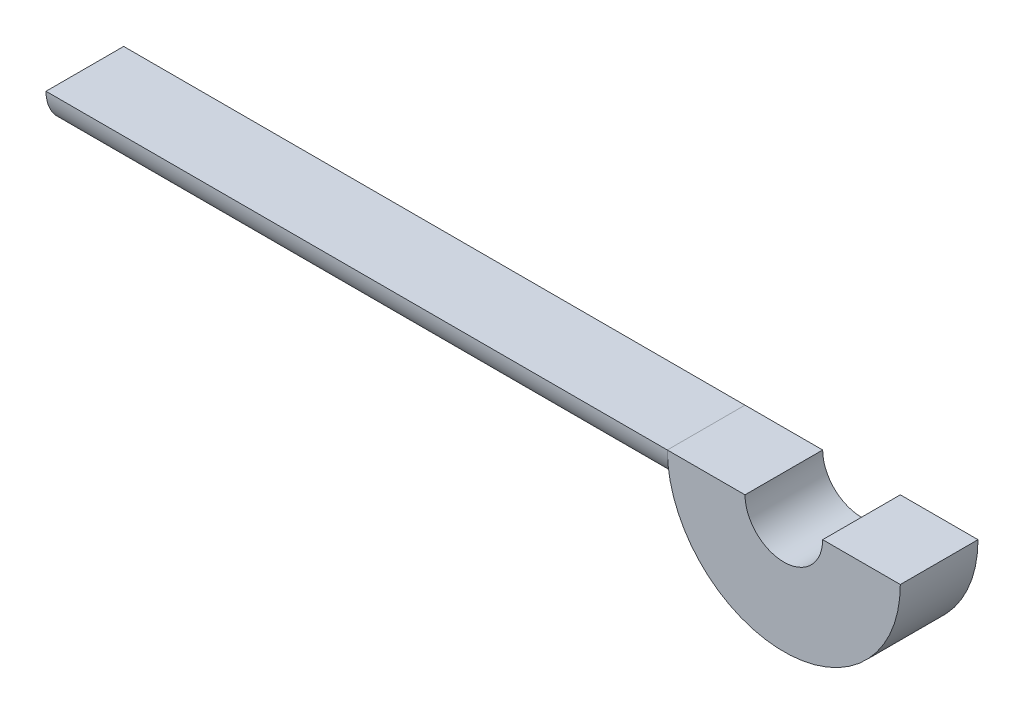
ISO-10303-21;
HEADER;
FILE_DESCRIPTION(('STEP AP214'),'2;1');
FILE_NAME('part.step','',(''),(''),'','','');
FILE_SCHEMA(('AUTOMOTIVE_DESIGN { 1 0 10303 214 1 1 1 1 }'));
ENDSEC;
DATA;
#1=APPLICATION_CONTEXT('core data for automotive mechanical design processes');
#2=APPLICATION_PROTOCOL_DEFINITION('international standard','automotive_design',2000,#1);
#3=PRODUCT_CONTEXT('',#1,'mechanical');
#4=PRODUCT('Part','Part','',(#3));
#5=PRODUCT_RELATED_PRODUCT_CATEGORY('part','',(#4));
#6=PRODUCT_DEFINITION_FORMATION('','',#4);
#7=PRODUCT_DEFINITION_CONTEXT('part definition',#1,'design');
#8=PRODUCT_DEFINITION('design','',#6,#7);
#9=PRODUCT_DEFINITION_SHAPE('','',#8);
#10=(LENGTH_UNIT() NAMED_UNIT(*) SI_UNIT(.MILLI.,.METRE.));
#11=(NAMED_UNIT(*) PLANE_ANGLE_UNIT() SI_UNIT($,.RADIAN.));
#12=(NAMED_UNIT(*) SI_UNIT($,.STERADIAN.) SOLID_ANGLE_UNIT());
#13=UNCERTAINTY_MEASURE_WITH_UNIT(LENGTH_MEASURE(1.E-05),#10,'distance_accuracy_value','');
#14=(GEOMETRIC_REPRESENTATION_CONTEXT(3) GLOBAL_UNCERTAINTY_ASSIGNED_CONTEXT((#13)) GLOBAL_UNIT_ASSIGNED_CONTEXT((#10,
#11,#12)) REPRESENTATION_CONTEXT('',''));
#15=CARTESIAN_POINT('',(0.,0.,0.));
#16=DIRECTION('',(0.,0.,1.));
#17=DIRECTION('',(1.,0.,0.));
#18=AXIS2_PLACEMENT_3D('',#15,#16,#17);
#19=CARTESIAN_POINT('',(0.,0.,6.35));
#20=DIRECTION('',(0.,0.,-1.));
#21=DIRECTION('',(-1.,0.,0.));
#22=AXIS2_PLACEMENT_3D('',#19,#20,#21);
#23=CYLINDRICAL_SURFACE('',#22,9.525);
#24=DIRECTION('',(0.,0.,1.));
#25=VECTOR('',#24,1.);
#26=CARTESIAN_POINT('',(-9.525,0.,0.));
#27=LINE('',#26,#25);
#28=CARTESIAN_POINT('',(-9.525,0.,0.));
#29=VERTEX_POINT('',#28);
#30=CARTESIAN_POINT('',(-9.525,0.,6.35));
#31=VERTEX_POINT('',#30);
#32=EDGE_CURVE('E47',#29,#31,#27,.T.);
#33=ORIENTED_EDGE('',*,*,#32,.T.);
#34=CARTESIAN_POINT('',(-9.525,0.,0.));
#35=CARTESIAN_POINT('',(-9.52501109919511,-0.0867584663977062,-1.11023860255168E-05));
#36=CARTESIAN_POINT('',(-9.52381490358395,-0.173509981731211,0.00355585934786174));
#37=CARTESIAN_POINT('',(-9.51909051162096,-0.346349012163513,0.0177597090178191));
#38=CARTESIAN_POINT('',(-9.51556285042762,-0.432436675054733,0.0283949745171486));
#39=CARTESIAN_POINT('',(-9.50627066001762,-0.60310661085966,0.056610999257891));
#40=CARTESIAN_POINT('',(-9.50051222160622,-0.687692332518318,0.0741728488373395));
#41=CARTESIAN_POINT('',(-9.48692225142781,-0.854978122631563,0.116065153540351));
#42=CARTESIAN_POINT('',(-9.47909066544468,-0.937678141710584,0.140395785679202));
#43=CARTESIAN_POINT('',(-9.4527851286968,-1.18202990115731,0.223232040874511));
#44=CARTESIAN_POINT('',(-9.43148755146662,-1.34015489920263,0.291619079964345));
#45=CARTESIAN_POINT('',(-9.38354321416617,-1.64264871240488,0.452546220210758));
#46=CARTESIAN_POINT('',(-9.3568937765036,-1.78701058819631,0.545098418436042));
#47=CARTESIAN_POINT('',(-9.30002341411486,-2.06291917458793,0.755092906094043));
#48=CARTESIAN_POINT('',(-9.26971730868141,-2.19392903526256,0.873218591562464));
#49=CARTESIAN_POINT('',(-9.20941621515659,-2.43469108780347,1.12955519328071));
#50=CARTESIAN_POINT('',(-9.1794213110126,-2.54443767806284,1.26777138544509));
#51=CARTESIAN_POINT('',(-9.12219770766827,-2.74264577137865,1.56523083998159));
#52=CARTESIAN_POINT('',(-9.09507334426462,-2.8304045251794,1.72496442923284));
#53=CARTESIAN_POINT('',(-9.04796508339338,-2.97757762410698,2.05796654735069));
#54=CARTESIAN_POINT('',(-9.0279787037604,-3.03700182471635,2.23123034562533));
#55=CARTESIAN_POINT('',(-8.99830903266046,-3.1237977547545,2.58023567965367));
#56=CARTESIAN_POINT('',(-8.98830124776583,-3.1521820951177,2.75569697695605));
#57=CARTESIAN_POINT('',(-8.97876208987997,-3.17925810515429,3.10915871241872));
#58=CARTESIAN_POINT('',(-8.97922769686119,-3.17795833431035,3.28715840383235));
#59=CARTESIAN_POINT('',(-8.99029876006837,-3.14648808580141,3.6319998447936));
#60=CARTESIAN_POINT('',(-9.00043983116337,-3.11763977550622,3.7989797508632));
#61=CARTESIAN_POINT('',(-9.02895910755938,-3.03404893324102,4.12557606992812));
#62=CARTESIAN_POINT('',(-9.04733819768608,-2.97930361970155,4.2851916899116));
#63=CARTESIAN_POINT('',(-9.09059374930723,-2.84460615052577,4.59553598381));
#64=CARTESIAN_POINT('',(-9.11557013374658,-2.76426204041518,4.74608001551939));
#65=CARTESIAN_POINT('',(-9.169163889702,-2.58092286667849,5.03196583018198));
#66=CARTESIAN_POINT('',(-9.1977822899943,-2.47792139691606,5.16730329725184));
#67=CARTESIAN_POINT('',(-9.25726024974148,-2.2458417076995,5.42635532027382));
#68=CARTESIAN_POINT('',(-9.28815887400631,-2.11568411554187,5.54909635365483));
#69=CARTESIAN_POINT('',(-9.34741529251624,-1.83626167057156,5.77127833228254));
#70=CARTESIAN_POINT('',(-9.37577242060814,-1.68699183299057,5.870713179697));
#71=CARTESIAN_POINT('',(-9.42713388591759,-1.37131076109635,6.0442924052174));
#72=CARTESIAN_POINT('',(-9.45007943454874,-1.20473727740139,6.11816276608183));
#73=CARTESIAN_POINT('',(-9.47821244443844,-0.946916440217424,6.20687528720103));
#74=CARTESIAN_POINT('',(-9.48654189071096,-0.859661200510917,6.2327620360959));
#75=CARTESIAN_POINT('',(-9.50088667992203,-0.683081906441541,6.27698176698283));
#76=CARTESIAN_POINT('',(-9.50690305067526,-0.593758789689705,6.29531810425675));
#77=CARTESIAN_POINT('',(-9.51607743691077,-0.420519434762281,6.32315751821451));
#78=CARTESIAN_POINT('',(-9.51941645032147,-0.336702022900161,6.33322138863382));
#79=CARTESIAN_POINT('',(-9.52388099236767,-0.168592339160273,6.34664255783373));
#80=CARTESIAN_POINT('',(-9.5250096152151,-0.084300896973188,6.35000923177883));
#81=CARTESIAN_POINT('',(-9.525,-1.87880717499807E-13,6.35));
#82=B_SPLINE_CURVE_WITH_KNOTS('',3,(#34,#35,#36,#37,#38,#39,#40,#41,#42,#43,#44,#45,#46,#47,#48,
#49,#50,#51,#52,#53,#54,#55,#56,#57,#58,#59,#60,#61,#62,#63,#64,#65,#66,#67,#68,#69,#70,#71,#72,
#73,#74,#75,#76,#77,#78,#79,#80,#81),.UNSPECIFIED.,.F.,.F.,(4,2,2,2,2,2,2,2,2,2,2,2,2,2,2,2,2,2,
2,2,2,2,2,4),(0.,0.260182031119286,0.52030436147065,0.779721416079441,1.0391452555276,
1.55732642770898,2.07576750018385,2.61030044044256,3.14497400743342,3.6950211945242,
4.24487692131438,4.77620387995586,5.30737763116523,5.81427561490482,6.3212280563819,
6.83634924065959,7.35161625780968,7.89374085367835,8.43600713312646,8.98391776815773,
9.25780219945113,9.53156478920259,9.78473028079912,10.0375411250328),.UNSPECIFIED.);
#83=EDGE_CURVE('E12',#29,#31,#82,.T.);
#84=ORIENTED_EDGE('',*,*,#83,.F.);
#85=EDGE_LOOP('',(#33,#84));
#86=FACE_BOUND('',#85,.T.);
#87=ADVANCED_FACE('F42',(#86),#23,.F.);
#88=CARTESIAN_POINT('',(500000.,0.,3.175));
#89=DIRECTION('',(-1.,0.,0.));
#90=DIRECTION('',(0.,0.,1.));
#91=AXIS2_PLACEMENT_3D('',#88,#89,#90);
#92=CYLINDRICAL_SURFACE('',#91,3.175);
#93=ORIENTED_EDGE('',*,*,#83,.T.);
#94=DIRECTION('',(1.,0.,0.));
#95=VECTOR('',#94,1.);
#96=CARTESIAN_POINT('',(-60.325,0.,6.35));
#97=LINE('',#96,#95);
#98=CARTESIAN_POINT('',(-60.325,0.,6.35));
#99=VERTEX_POINT('',#98);
#100=EDGE_CURVE('E58',#99,#31,#97,.T.);
#101=ORIENTED_EDGE('',*,*,#100,.F.);
#102=CARTESIAN_POINT('',(-60.325,0.,3.175));
#103=DIRECTION('',(-1.,0.,0.));
#104=DIRECTION('',(0.,0.,1.));
#105=AXIS2_PLACEMENT_3D('',#102,#103,#104);
#106=CIRCLE('',#105,3.175);
#107=CARTESIAN_POINT('',(-60.325,0.,0.));
#108=VERTEX_POINT('',#107);
#109=EDGE_CURVE('E71',#108,#99,#106,.T.);
#110=ORIENTED_EDGE('',*,*,#109,.F.);
#111=DIRECTION('',(1.,0.,0.));
#112=VECTOR('',#111,1.);
#113=CARTESIAN_POINT('',(-60.325,0.,0.));
#114=LINE('',#113,#112);
#115=EDGE_CURVE('E63',#108,#29,#114,.T.);
#116=ORIENTED_EDGE('',*,*,#115,.T.);
#117=EDGE_LOOP('',(#93,#101,#110,#116));
#118=FACE_BOUND('',#117,.T.);
#119=ADVANCED_FACE('F44',(#118),#92,.T.);
#120=CARTESIAN_POINT('',(-60.325,0.,0.));
#121=DIRECTION('',(0.,1.,0.));
#122=DIRECTION('',(0.,0.,1.));
#123=AXIS2_PLACEMENT_3D('',#120,#121,#122);
#124=PLANE('',#123);
#125=ORIENTED_EDGE('',*,*,#32,.F.);
#126=ORIENTED_EDGE('',*,*,#115,.F.);
#127=DIRECTION('',(0.,0.,1.));
#128=VECTOR('',#127,1.);
#129=CARTESIAN_POINT('',(-60.325,0.,0.));
#130=LINE('',#129,#128);
#131=EDGE_CURVE('E73',#108,#99,#130,.T.);
#132=ORIENTED_EDGE('',*,*,#131,.T.);
#133=ORIENTED_EDGE('',*,*,#100,.T.);
#134=EDGE_LOOP('',(#125,#126,#132,#133));
#135=FACE_BOUND('',#134,.T.);
#136=ADVANCED_FACE('F75',(#135),#124,.T.);
#137=CARTESIAN_POINT('',(-60.325,0.,3.175));
#138=DIRECTION('',(-1.,0.,0.));
#139=DIRECTION('',(0.,0.,1.));
#140=AXIS2_PLACEMENT_3D('',#137,#138,#139);
#141=PLANE('',#140);
#142=ORIENTED_EDGE('',*,*,#109,.T.);
#143=ORIENTED_EDGE('',*,*,#131,.F.);
#144=EDGE_LOOP('',(#142,#143));
#145=FACE_BOUND('',#144,.T.);
#146=ADVANCED_FACE('F92',(#145),#141,.T.);
#147=CLOSED_SHELL('',(#87,#119,#136,#146));
#148=MANIFOLD_SOLID_BREP('B2',#147);
#149=CARTESIAN_POINT('',(0.,0.,6.35));
#150=DIRECTION('',(0.,0.,-1.));
#151=DIRECTION('',(-1.,0.,0.));
#152=AXIS2_PLACEMENT_3D('',#149,#150,#151);
#153=CYLINDRICAL_SURFACE('',#152,9.525);
#154=CARTESIAN_POINT('',(0.,0.,0.));
#155=DIRECTION('',(0.,0.,1.));
#156=DIRECTION('',(1.,0.,0.));
#157=AXIS2_PLACEMENT_3D('',#154,#155,#156);
#158=CIRCLE('',#157,9.525);
#159=CARTESIAN_POINT('',(-9.525,0.,0.));
#160=VERTEX_POINT('',#159);
#161=CARTESIAN_POINT('',(9.525,0.,0.));
#162=VERTEX_POINT('',#161);
#163=EDGE_CURVE('E182',#160,#162,#158,.T.);
#164=ORIENTED_EDGE('',*,*,#163,.T.);
#165=DIRECTION('',(0.,0.,-1.));
#166=VECTOR('',#165,1.);
#167=CARTESIAN_POINT('',(9.525,0.,6.35));
#168=LINE('',#167,#166);
#169=CARTESIAN_POINT('',(9.525,0.,6.35));
#170=VERTEX_POINT('',#169);
#171=EDGE_CURVE('E40',#170,#162,#168,.T.);
#172=ORIENTED_EDGE('',*,*,#171,.F.);
#173=CARTESIAN_POINT('',(0.,0.,6.35));
#174=DIRECTION('',(0.,0.,1.));
#175=DIRECTION('',(1.,0.,0.));
#176=AXIS2_PLACEMENT_3D('',#173,#174,#175);
#177=CIRCLE('',#176,9.525);
#178=CARTESIAN_POINT('',(-9.525,0.,6.35));
#179=VERTEX_POINT('',#178);
#180=EDGE_CURVE('E170',#179,#170,#177,.T.);
#181=ORIENTED_EDGE('',*,*,#180,.F.);
#182=DIRECTION('',(0.,0.,-1.));
#183=VECTOR('',#182,1.);
#184=CARTESIAN_POINT('',(-9.525,0.,6.35));
#185=LINE('',#184,#183);
#186=EDGE_CURVE('E178',#179,#160,#185,.T.);
#187=ORIENTED_EDGE('',*,*,#186,.T.);
#188=EDGE_LOOP('',(#164,#172,#181,#187));
#189=FACE_BOUND('',#188,.T.);
#190=ADVANCED_FACE('F119',(#189),#153,.T.);
#191=CARTESIAN_POINT('',(3.175,0.,6.35));
#192=DIRECTION('',(0.,-1.,0.));
#193=DIRECTION('',(0.,0.,-1.));
#194=AXIS2_PLACEMENT_3D('',#191,#192,#193);
#195=PLANE('',#194);
#196=DIRECTION('',(-1.,0.,0.));
#197=VECTOR('',#196,1.);
#198=CARTESIAN_POINT('',(3.175,0.,0.));
#199=LINE('',#198,#197);
#200=CARTESIAN_POINT('',(3.175,0.,0.));
#201=VERTEX_POINT('',#200);
#202=EDGE_CURVE('E174',#162,#201,#199,.T.);
#203=ORIENTED_EDGE('',*,*,#202,.T.);
#204=DIRECTION('',(0.,0.,-1.));
#205=VECTOR('',#204,1.);
#206=CARTESIAN_POINT('',(3.175,0.,6.35));
#207=LINE('',#206,#205);
#208=CARTESIAN_POINT('',(3.175,0.,6.35));
#209=VERTEX_POINT('',#208);
#210=EDGE_CURVE('E127',#209,#201,#207,.T.);
#211=ORIENTED_EDGE('',*,*,#210,.F.);
#212=DIRECTION('',(-1.,0.,0.));
#213=VECTOR('',#212,1.);
#214=CARTESIAN_POINT('',(3.175,0.,6.35));
#215=LINE('',#214,#213);
#216=EDGE_CURVE('E165',#170,#209,#215,.T.);
#217=ORIENTED_EDGE('',*,*,#216,.F.);
#218=ORIENTED_EDGE('',*,*,#171,.T.);
#219=EDGE_LOOP('',(#203,#211,#217,#218));
#220=FACE_BOUND('',#219,.T.);
#221=ADVANCED_FACE('F173',(#220),#195,.F.);
#222=CARTESIAN_POINT('',(0.,0.,6.35));
#223=DIRECTION('',(0.,0.,-1.));
#224=DIRECTION('',(-1.,0.,0.));
#225=AXIS2_PLACEMENT_3D('',#222,#223,#224);
#226=CYLINDRICAL_SURFACE('',#225,3.175);
#227=CARTESIAN_POINT('',(0.,0.,0.));
#228=DIRECTION('',(0.,0.,-1.));
#229=DIRECTION('',(1.,0.,0.));
#230=AXIS2_PLACEMENT_3D('',#227,#228,#229);
#231=CIRCLE('',#230,3.175);
#232=CARTESIAN_POINT('',(-3.175,0.,0.));
#233=VERTEX_POINT('',#232);
#234=EDGE_CURVE('E152',#201,#233,#231,.T.);
#235=ORIENTED_EDGE('',*,*,#234,.T.);
#236=DIRECTION('',(0.,0.,-1.));
#237=VECTOR('',#236,1.);
#238=CARTESIAN_POINT('',(-3.175,0.,6.35));
#239=LINE('',#238,#237);
#240=CARTESIAN_POINT('',(-3.175,0.,6.35));
#241=VERTEX_POINT('',#240);
#242=EDGE_CURVE('E175',#241,#233,#239,.T.);
#243=ORIENTED_EDGE('',*,*,#242,.F.);
#244=CARTESIAN_POINT('',(0.,0.,6.35));
#245=DIRECTION('',(0.,0.,-1.));
#246=DIRECTION('',(1.,0.,0.));
#247=AXIS2_PLACEMENT_3D('',#244,#245,#246);
#248=CIRCLE('',#247,3.175);
#249=EDGE_CURVE('E168',#209,#241,#248,.T.);
#250=ORIENTED_EDGE('',*,*,#249,.F.);
#251=ORIENTED_EDGE('',*,*,#210,.T.);
#252=EDGE_LOOP('',(#235,#243,#250,#251));
#253=FACE_BOUND('',#252,.T.);
#254=ADVANCED_FACE('F176',(#253),#226,.F.);
#255=CARTESIAN_POINT('',(-9.525,0.,6.35));
#256=DIRECTION('',(0.,-1.,0.));
#257=DIRECTION('',(0.,0.,-1.));
#258=AXIS2_PLACEMENT_3D('',#255,#256,#257);
#259=PLANE('',#258);
#260=DIRECTION('',(-1.,0.,0.));
#261=VECTOR('',#260,1.);
#262=CARTESIAN_POINT('',(-9.525,0.,0.));
#263=LINE('',#262,#261);
#264=EDGE_CURVE('E158',#233,#160,#263,.T.);
#265=ORIENTED_EDGE('',*,*,#264,.T.);
#266=ORIENTED_EDGE('',*,*,#186,.F.);
#267=DIRECTION('',(-1.,0.,0.));
#268=VECTOR('',#267,1.);
#269=CARTESIAN_POINT('',(-9.525,0.,6.35));
#270=LINE('',#269,#268);
#271=EDGE_CURVE('E135',#241,#179,#270,.T.);
#272=ORIENTED_EDGE('',*,*,#271,.F.);
#273=ORIENTED_EDGE('',*,*,#242,.T.);
#274=EDGE_LOOP('',(#265,#266,#272,#273));
#275=FACE_BOUND('',#274,.T.);
#276=ADVANCED_FACE('F189',(#275),#259,.F.);
#277=CARTESIAN_POINT('',(0.,0.,6.35));
#278=DIRECTION('',(0.,0.,1.));
#279=DIRECTION('',(1.,0.,0.));
#280=AXIS2_PLACEMENT_3D('',#277,#278,#279);
#281=PLANE('',#280);
#282=ORIENTED_EDGE('',*,*,#180,.T.);
#283=ORIENTED_EDGE('',*,*,#216,.T.);
#284=ORIENTED_EDGE('',*,*,#249,.T.);
#285=ORIENTED_EDGE('',*,*,#271,.T.);
#286=EDGE_LOOP('',(#282,#283,#284,#285));
#287=FACE_BOUND('',#286,.T.);
#288=ADVANCED_FACE('F166',(#287),#281,.T.);
#289=CARTESIAN_POINT('',(0.,0.,0.));
#290=DIRECTION('',(0.,0.,1.));
#291=DIRECTION('',(1.,0.,0.));
#292=AXIS2_PLACEMENT_3D('',#289,#290,#291);
#293=PLANE('',#292);
#294=ORIENTED_EDGE('',*,*,#163,.F.);
#295=ORIENTED_EDGE('',*,*,#264,.F.);
#296=ORIENTED_EDGE('',*,*,#234,.F.);
#297=ORIENTED_EDGE('',*,*,#202,.F.);
#298=EDGE_LOOP('',(#294,#295,#296,#297));
#299=FACE_BOUND('',#298,.T.);
#300=ADVANCED_FACE('F192',(#299),#293,.F.);
#301=CLOSED_SHELL('',(#190,#221,#254,#276,#288,#300));
#302=MANIFOLD_SOLID_BREP('B6',#301);
#303=ADVANCED_BREP_SHAPE_REPRESENTATION('',(#18,#148,#302),#14);
#304=SHAPE_DEFINITION_REPRESENTATION(#9,#303);
ENDSEC;
END-ISO-10303-21;
